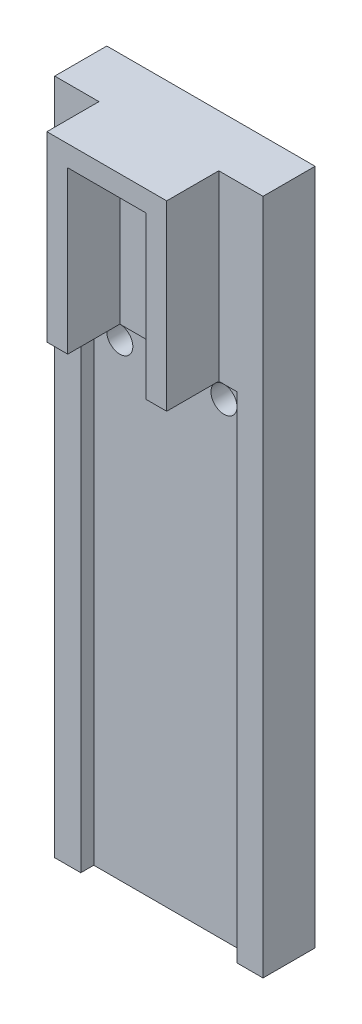
ISO-10303-21;
HEADER;
FILE_DESCRIPTION(('STEP AP214'),'2;1');
FILE_NAME('part.step','',(''),(''),'','','');
FILE_SCHEMA(('AUTOMOTIVE_DESIGN { 1 0 10303 214 1 1 1 1 }'));
ENDSEC;
DATA;
#1=APPLICATION_CONTEXT('core data for automotive mechanical design processes');
#2=APPLICATION_PROTOCOL_DEFINITION('international standard','automotive_design',2000,#1);
#3=PRODUCT_CONTEXT('',#1,'mechanical');
#4=PRODUCT('Part','Part','',(#3));
#5=PRODUCT_RELATED_PRODUCT_CATEGORY('part','',(#4));
#6=PRODUCT_DEFINITION_FORMATION('','',#4);
#7=PRODUCT_DEFINITION_CONTEXT('part definition',#1,'design');
#8=PRODUCT_DEFINITION('design','',#6,#7);
#9=PRODUCT_DEFINITION_SHAPE('','',#8);
#10=(LENGTH_UNIT() NAMED_UNIT(*) SI_UNIT(.MILLI.,.METRE.));
#11=(NAMED_UNIT(*) PLANE_ANGLE_UNIT() SI_UNIT($,.RADIAN.));
#12=(NAMED_UNIT(*) SI_UNIT($,.STERADIAN.) SOLID_ANGLE_UNIT());
#13=UNCERTAINTY_MEASURE_WITH_UNIT(LENGTH_MEASURE(1.E-05),#10,'distance_accuracy_value','');
#14=(GEOMETRIC_REPRESENTATION_CONTEXT(3) GLOBAL_UNCERTAINTY_ASSIGNED_CONTEXT((#13)) GLOBAL_UNIT_ASSIGNED_CONTEXT((#10,
#11,#12)) REPRESENTATION_CONTEXT('',''));
#15=CARTESIAN_POINT('',(0.,0.,0.));
#16=DIRECTION('',(0.,0.,1.));
#17=DIRECTION('',(1.,0.,0.));
#18=AXIS2_PLACEMENT_3D('',#15,#16,#17);
#19=CARTESIAN_POINT('',(0.,0.,6.35));
#20=DIRECTION('',(0.,0.,-1.));
#21=DIRECTION('',(-1.,0.,0.));
#22=AXIS2_PLACEMENT_3D('',#19,#20,#21);
#23=PLANE('',#22);
#24=DIRECTION('',(0.,-1.,0.));
#25=VECTOR('',#24,1.);
#26=CARTESIAN_POINT('',(-7.3025,41.275,6.35));
#27=LINE('',#26,#25);
#28=CARTESIAN_POINT('',(-7.3025,41.275,6.35));
#29=VERTEX_POINT('',#28);
#30=CARTESIAN_POINT('',(-7.3025,19.05,6.35));
#31=VERTEX_POINT('',#30);
#32=EDGE_CURVE('E50',#29,#31,#27,.T.);
#33=ORIENTED_EDGE('',*,*,#32,.F.);
#34=DIRECTION('',(-1.,0.,0.));
#35=VECTOR('',#34,1.);
#36=CARTESIAN_POINT('',(-12.7,41.275,6.35));
#37=LINE('',#36,#35);
#38=CARTESIAN_POINT('',(-12.7,41.275,6.35));
#39=VERTEX_POINT('',#38);
#40=EDGE_CURVE('E257',#29,#39,#37,.T.);
#41=ORIENTED_EDGE('',*,*,#40,.T.);
#42=DIRECTION('',(0.,-1.,0.));
#43=VECTOR('',#42,1.);
#44=CARTESIAN_POINT('',(-12.7,-41.275,6.35));
#45=LINE('',#44,#43);
#46=CARTESIAN_POINT('',(-12.7,-41.275,6.35));
#47=VERTEX_POINT('',#46);
#48=EDGE_CURVE('E260',#39,#47,#45,.T.);
#49=ORIENTED_EDGE('',*,*,#48,.T.);
#50=DIRECTION('',(1.,0.,0.));
#51=VECTOR('',#50,1.);
#52=CARTESIAN_POINT('',(-12.7,-41.275,6.35));
#53=LINE('',#52,#51);
#54=CARTESIAN_POINT('',(-9.525,-41.275,6.35));
#55=VERTEX_POINT('',#54);
#56=EDGE_CURVE('E263',#47,#55,#53,.T.);
#57=ORIENTED_EDGE('',*,*,#56,.T.);
#58=DIRECTION('',(0.,-1.,0.));
#59=VECTOR('',#58,1.);
#60=CARTESIAN_POINT('',(-9.525,-41.275,6.35));
#61=LINE('',#60,#59);
#62=CARTESIAN_POINT('',(-9.525,19.05,6.35));
#63=VERTEX_POINT('',#62);
#64=EDGE_CURVE('E214',#63,#55,#61,.T.);
#65=ORIENTED_EDGE('',*,*,#64,.F.);
#66=DIRECTION('',(-1.,0.,0.));
#67=VECTOR('',#66,1.);
#68=CARTESIAN_POINT('',(-9.525,19.05,6.35));
#69=LINE('',#68,#67);
#70=EDGE_CURVE('E233',#31,#63,#69,.T.);
#71=ORIENTED_EDGE('',*,*,#70,.F.);
#72=EDGE_LOOP('',(#33,#41,#49,#57,#65,#71));
#73=FACE_BOUND('',#72,.T.);
#74=ADVANCED_FACE('F33',(#73),#23,.F.);
#75=DIRECTION('',(0.,1.,0.));
#76=VECTOR('',#75,1.);
#77=CARTESIAN_POINT('',(7.3025,41.275,6.35));
#78=LINE('',#77,#76);
#79=CARTESIAN_POINT('',(7.30249999999999,19.05,6.35));
#80=VERTEX_POINT('',#79);
#81=CARTESIAN_POINT('',(7.3025,41.275,6.35));
#82=VERTEX_POINT('',#81);
#83=EDGE_CURVE('E182',#80,#82,#78,.T.);
#84=ORIENTED_EDGE('',*,*,#83,.F.);
#85=CARTESIAN_POINT('',(9.525,19.05,6.35));
#86=VERTEX_POINT('',#85);
#87=EDGE_CURVE('E219',#86,#80,#69,.T.);
#88=ORIENTED_EDGE('',*,*,#87,.F.);
#89=DIRECTION('',(0.,1.,0.));
#90=VECTOR('',#89,1.);
#91=CARTESIAN_POINT('',(9.52500000000001,-41.275,6.35));
#92=LINE('',#91,#90);
#93=CARTESIAN_POINT('',(9.52500000000001,-41.275,6.35));
#94=VERTEX_POINT('',#93);
#95=EDGE_CURVE('E230',#94,#86,#92,.T.);
#96=ORIENTED_EDGE('',*,*,#95,.F.);
#97=CARTESIAN_POINT('',(12.7,-41.275,6.35));
#98=VERTEX_POINT('',#97);
#99=EDGE_CURVE('E262',#94,#98,#53,.T.);
#100=ORIENTED_EDGE('',*,*,#99,.T.);
#101=DIRECTION('',(0.,1.,0.));
#102=VECTOR('',#101,1.);
#103=CARTESIAN_POINT('',(12.7,-41.275,6.35));
#104=LINE('',#103,#102);
#105=CARTESIAN_POINT('',(12.7,41.275,6.35));
#106=VERTEX_POINT('',#105);
#107=EDGE_CURVE('E255',#98,#106,#104,.T.);
#108=ORIENTED_EDGE('',*,*,#107,.T.);
#109=EDGE_CURVE('E58',#106,#82,#37,.T.);
#110=ORIENTED_EDGE('',*,*,#109,.T.);
#111=EDGE_LOOP('',(#84,#88,#96,#100,#108,#110));
#112=FACE_BOUND('',#111,.T.);
#113=ADVANCED_FACE('F369',(#112),#23,.F.);
#114=DIRECTION('',(0.,-1.,0.));
#115=VECTOR('',#114,1.);
#116=CARTESIAN_POINT('',(4.7625,38.735,6.35));
#117=LINE('',#116,#115);
#118=CARTESIAN_POINT('',(4.7625,32.385,6.35));
#119=VERTEX_POINT('',#118);
#120=CARTESIAN_POINT('',(4.7625,19.05,6.35));
#121=VERTEX_POINT('',#120);
#122=EDGE_CURVE('E11',#119,#121,#117,.T.);
#123=ORIENTED_EDGE('',*,*,#122,.F.);
#124=DIRECTION('',(-1.,0.,0.));
#125=VECTOR('',#124,1.);
#126=CARTESIAN_POINT('',(0.,32.385,6.35));
#127=LINE('',#126,#125);
#128=CARTESIAN_POINT('',(-4.7625,32.385,6.35));
#129=VERTEX_POINT('',#128);
#130=EDGE_CURVE('E206',#119,#129,#127,.T.);
#131=ORIENTED_EDGE('',*,*,#130,.T.);
#132=DIRECTION('',(0.,1.,0.));
#133=VECTOR('',#132,1.);
#134=CARTESIAN_POINT('',(-4.7625,38.735,6.35));
#135=LINE('',#134,#133);
#136=CARTESIAN_POINT('',(-4.7625,19.05,6.35));
#137=VERTEX_POINT('',#136);
#138=EDGE_CURVE('E334',#137,#129,#135,.T.);
#139=ORIENTED_EDGE('',*,*,#138,.F.);
#140=EDGE_CURVE('E235',#121,#137,#69,.T.);
#141=ORIENTED_EDGE('',*,*,#140,.F.);
#142=EDGE_LOOP('',(#123,#131,#139,#141));
#143=FACE_BOUND('',#142,.T.);
#144=ADVANCED_FACE('F326',(#143),#23,.F.);
#145=CARTESIAN_POINT('',(12.7,-41.275,6.35));
#146=DIRECTION('',(-1.,0.,0.));
#147=DIRECTION('',(0.,0.,1.));
#148=AXIS2_PLACEMENT_3D('',#145,#146,#147);
#149=PLANE('',#148);
#150=DIRECTION('',(0.,1.,0.));
#151=VECTOR('',#150,1.);
#152=CARTESIAN_POINT('',(12.7,-41.275,0.));
#153=LINE('',#152,#151);
#154=CARTESIAN_POINT('',(12.7,-41.275,0.));
#155=VERTEX_POINT('',#154);
#156=CARTESIAN_POINT('',(12.7,41.275,0.));
#157=VERTEX_POINT('',#156);
#158=EDGE_CURVE('E252',#155,#157,#153,.T.);
#159=ORIENTED_EDGE('',*,*,#158,.T.);
#160=DIRECTION('',(0.,0.,-1.));
#161=VECTOR('',#160,1.);
#162=CARTESIAN_POINT('',(12.7,41.275,6.35));
#163=LINE('',#162,#161);
#164=EDGE_CURVE('E42',#106,#157,#163,.T.);
#165=ORIENTED_EDGE('',*,*,#164,.F.);
#166=ORIENTED_EDGE('',*,*,#107,.F.);
#167=DIRECTION('',(0.,0.,-1.));
#168=VECTOR('',#167,1.);
#169=CARTESIAN_POINT('',(12.7,-41.275,6.35));
#170=LINE('',#169,#168);
#171=EDGE_CURVE('E266',#98,#155,#170,.T.);
#172=ORIENTED_EDGE('',*,*,#171,.T.);
#173=EDGE_LOOP('',(#159,#165,#166,#172));
#174=FACE_BOUND('',#173,.T.);
#175=ADVANCED_FACE('F35',(#174),#149,.F.);
#176=CARTESIAN_POINT('',(-12.7,41.275,6.35));
#177=DIRECTION('',(0.,-1.,0.));
#178=DIRECTION('',(0.,0.,-1.));
#179=AXIS2_PLACEMENT_3D('',#176,#177,#178);
#180=PLANE('',#179);
#181=DIRECTION('',(-1.,0.,0.));
#182=VECTOR('',#181,1.);
#183=CARTESIAN_POINT('',(-12.7,41.275,0.));
#184=LINE('',#183,#182);
#185=CARTESIAN_POINT('',(-12.7,41.275,0.));
#186=VERTEX_POINT('',#185);
#187=EDGE_CURVE('E269',#157,#186,#184,.T.);
#188=ORIENTED_EDGE('',*,*,#187,.T.);
#189=DIRECTION('',(0.,0.,-1.));
#190=VECTOR('',#189,1.);
#191=CARTESIAN_POINT('',(-12.7,41.275,6.35));
#192=LINE('',#191,#190);
#193=EDGE_CURVE('E279',#39,#186,#192,.T.);
#194=ORIENTED_EDGE('',*,*,#193,.F.);
#195=ORIENTED_EDGE('',*,*,#40,.F.);
#196=DIRECTION('',(0.,0.,-1.));
#197=VECTOR('',#196,1.);
#198=CARTESIAN_POINT('',(-7.3025,41.275,12.7));
#199=LINE('',#198,#197);
#200=CARTESIAN_POINT('',(-7.3025,41.275,12.7));
#201=VERTEX_POINT('',#200);
#202=EDGE_CURVE('E304',#201,#29,#199,.T.);
#203=ORIENTED_EDGE('',*,*,#202,.F.);
#204=DIRECTION('',(-1.,0.,0.));
#205=VECTOR('',#204,1.);
#206=CARTESIAN_POINT('',(-7.3025,41.275,12.7));
#207=LINE('',#206,#205);
#208=CARTESIAN_POINT('',(7.3025,41.275,12.7));
#209=VERTEX_POINT('',#208);
#210=EDGE_CURVE('E178',#209,#201,#207,.T.);
#211=ORIENTED_EDGE('',*,*,#210,.F.);
#212=DIRECTION('',(0.,0.,-1.));
#213=VECTOR('',#212,1.);
#214=CARTESIAN_POINT('',(7.3025,41.275,12.7));
#215=LINE('',#214,#213);
#216=EDGE_CURVE('E305',#209,#82,#215,.T.);
#217=ORIENTED_EDGE('',*,*,#216,.T.);
#218=ORIENTED_EDGE('',*,*,#109,.F.);
#219=ORIENTED_EDGE('',*,*,#164,.T.);
#220=EDGE_LOOP('',(#188,#194,#195,#203,#211,#217,#218,#219));
#221=FACE_BOUND('',#220,.T.);
#222=ADVANCED_FACE('F284',(#221),#180,.F.);
#223=CARTESIAN_POINT('',(-12.7,-41.275,6.35));
#224=DIRECTION('',(1.,0.,0.));
#225=DIRECTION('',(0.,0.,-1.));
#226=AXIS2_PLACEMENT_3D('',#223,#224,#225);
#227=PLANE('',#226);
#228=DIRECTION('',(0.,-1.,0.));
#229=VECTOR('',#228,1.);
#230=CARTESIAN_POINT('',(-12.7,-41.275,0.));
#231=LINE('',#230,#229);
#232=CARTESIAN_POINT('',(-12.7,-41.275,0.));
#233=VERTEX_POINT('',#232);
#234=EDGE_CURVE('E271',#186,#233,#231,.T.);
#235=ORIENTED_EDGE('',*,*,#234,.T.);
#236=DIRECTION('',(0.,0.,-1.));
#237=VECTOR('',#236,1.);
#238=CARTESIAN_POINT('',(-12.7,-41.275,6.35));
#239=LINE('',#238,#237);
#240=EDGE_CURVE('E276',#47,#233,#239,.T.);
#241=ORIENTED_EDGE('',*,*,#240,.F.);
#242=ORIENTED_EDGE('',*,*,#48,.F.);
#243=ORIENTED_EDGE('',*,*,#193,.T.);
#244=EDGE_LOOP('',(#235,#241,#242,#243));
#245=FACE_BOUND('',#244,.T.);
#246=ADVANCED_FACE('F297',(#245),#227,.F.);
#247=CARTESIAN_POINT('',(-12.7,-41.275,6.35));
#248=DIRECTION('',(0.,1.,0.));
#249=DIRECTION('',(0.,0.,1.));
#250=AXIS2_PLACEMENT_3D('',#247,#248,#249);
#251=PLANE('',#250);
#252=DIRECTION('',(1.,0.,0.));
#253=VECTOR('',#252,1.);
#254=CARTESIAN_POINT('',(-9.525,-41.275,4.7625));
#255=LINE('',#254,#253);
#256=CARTESIAN_POINT('',(-9.525,-41.275,4.7625));
#257=VERTEX_POINT('',#256);
#258=CARTESIAN_POINT('',(9.52500000000001,-41.275,4.7625));
#259=VERTEX_POINT('',#258);
#260=EDGE_CURVE('E218',#257,#259,#255,.T.);
#261=ORIENTED_EDGE('',*,*,#260,.F.);
#262=DIRECTION('',(0.,0.,1.));
#263=VECTOR('',#262,1.);
#264=CARTESIAN_POINT('',(-9.525,-41.275,4.7625));
#265=LINE('',#264,#263);
#266=EDGE_CURVE('E228',#257,#55,#265,.T.);
#267=ORIENTED_EDGE('',*,*,#266,.T.);
#268=ORIENTED_EDGE('',*,*,#56,.F.);
#269=ORIENTED_EDGE('',*,*,#240,.T.);
#270=DIRECTION('',(1.,0.,0.));
#271=VECTOR('',#270,1.);
#272=CARTESIAN_POINT('',(-12.7,-41.275,0.));
#273=LINE('',#272,#271);
#274=EDGE_CURVE('E258',#233,#155,#273,.T.);
#275=ORIENTED_EDGE('',*,*,#274,.T.);
#276=ORIENTED_EDGE('',*,*,#171,.F.);
#277=ORIENTED_EDGE('',*,*,#99,.F.);
#278=DIRECTION('',(0.,0.,1.));
#279=VECTOR('',#278,1.);
#280=CARTESIAN_POINT('',(9.52500000000001,-41.275,4.7625));
#281=LINE('',#280,#279);
#282=EDGE_CURVE('E241',#259,#94,#281,.T.);
#283=ORIENTED_EDGE('',*,*,#282,.F.);
#284=EDGE_LOOP('',(#261,#267,#268,#269,#275,#276,#277,#283));
#285=FACE_BOUND('',#284,.T.);
#286=ADVANCED_FACE('F302',(#285),#251,.F.);
#287=CARTESIAN_POINT('',(0.,0.,0.));
#288=DIRECTION('',(0.,0.,-1.));
#289=DIRECTION('',(-1.,0.,0.));
#290=AXIS2_PLACEMENT_3D('',#287,#288,#289);
#291=PLANE('',#290);
#292=DIRECTION('',(0.,1.,0.));
#293=VECTOR('',#292,1.);
#294=CARTESIAN_POINT('',(4.7625,38.735,0.));
#295=LINE('',#294,#293);
#296=CARTESIAN_POINT('',(4.7625,32.385,0.));
#297=VERTEX_POINT('',#296);
#298=CARTESIAN_POINT('',(4.7625,38.735,0.));
#299=VERTEX_POINT('',#298);
#300=EDGE_CURVE('E185',#297,#299,#295,.T.);
#301=ORIENTED_EDGE('',*,*,#300,.T.);
#302=DIRECTION('',(-1.,0.,0.));
#303=VECTOR('',#302,1.);
#304=CARTESIAN_POINT('',(4.7625,38.735,0.));
#305=LINE('',#304,#303);
#306=CARTESIAN_POINT('',(-4.7625,38.735,0.));
#307=VERTEX_POINT('',#306);
#308=EDGE_CURVE('E188',#299,#307,#305,.T.);
#309=ORIENTED_EDGE('',*,*,#308,.T.);
#310=DIRECTION('',(0.,-1.,0.));
#311=VECTOR('',#310,1.);
#312=CARTESIAN_POINT('',(-4.7625,38.735,0.));
#313=LINE('',#312,#311);
#314=CARTESIAN_POINT('',(-4.7625,32.385,0.));
#315=VERTEX_POINT('',#314);
#316=EDGE_CURVE('E196',#307,#315,#313,.T.);
#317=ORIENTED_EDGE('',*,*,#316,.T.);
#318=DIRECTION('',(1.,0.,0.));
#319=VECTOR('',#318,1.);
#320=CARTESIAN_POINT('',(4.7625,32.385,0.));
#321=LINE('',#320,#319);
#322=EDGE_CURVE('E199',#315,#297,#321,.T.);
#323=ORIENTED_EDGE('',*,*,#322,.T.);
#324=EDGE_LOOP('',(#301,#309,#317,#323));
#325=FACE_BOUND('',#324,.T.);
#326=CARTESIAN_POINT('',(-6.35,15.875,0.));
#327=DIRECTION('',(0.,0.,1.));
#328=DIRECTION('',(1.,0.,0.));
#329=AXIS2_PLACEMENT_3D('',#326,#327,#328);
#330=CIRCLE('',#329,1.5875);
#331=CARTESIAN_POINT('',(-4.7625,15.875,0.));
#332=VERTEX_POINT('',#331);
#333=EDGE_CURVE('E249',#332,#332,#330,.T.);
#334=ORIENTED_EDGE('',*,*,#333,.T.);
#335=EDGE_LOOP('',(#334));
#336=FACE_BOUND('',#335,.T.);
#337=CARTESIAN_POINT('',(6.35000000000001,15.875,0.));
#338=DIRECTION('',(0.,0.,1.));
#339=DIRECTION('',(-1.,0.,0.));
#340=AXIS2_PLACEMENT_3D('',#337,#338,#339);
#341=CIRCLE('',#340,1.5875);
#342=CARTESIAN_POINT('',(4.76250000000001,15.875,0.));
#343=VERTEX_POINT('',#342);
#344=EDGE_CURVE('E248',#343,#343,#341,.T.);
#345=ORIENTED_EDGE('',*,*,#344,.T.);
#346=EDGE_LOOP('',(#345));
#347=FACE_BOUND('',#346,.T.);
#348=ORIENTED_EDGE('',*,*,#158,.F.);
#349=ORIENTED_EDGE('',*,*,#274,.F.);
#350=ORIENTED_EDGE('',*,*,#234,.F.);
#351=ORIENTED_EDGE('',*,*,#187,.F.);
#352=EDGE_LOOP('',(#348,#349,#350,#351));
#353=FACE_BOUND('',#352,.T.);
#354=ADVANCED_FACE('F293',(#325,#336,#347,#353),#291,.T.);
#355=CARTESIAN_POINT('',(6.35000000000001,15.875,0.));
#356=DIRECTION('',(0.,0.,1.));
#357=DIRECTION('',(1.,0.,0.));
#358=AXIS2_PLACEMENT_3D('',#355,#356,#357);
#359=CYLINDRICAL_SURFACE('',#358,1.5875);
#360=CARTESIAN_POINT('',(6.35000000000001,15.875,4.7625));
#361=DIRECTION('',(0.,0.,-1.));
#362=DIRECTION('',(-1.,0.,0.));
#363=AXIS2_PLACEMENT_3D('',#360,#361,#362);
#364=CIRCLE('',#363,1.5875);
#365=CARTESIAN_POINT('',(4.76250000000001,15.875,4.7625));
#366=VERTEX_POINT('',#365);
#367=EDGE_CURVE('E245',#366,#366,#364,.F.);
#368=ORIENTED_EDGE('',*,*,#367,.T.);
#369=EDGE_LOOP('',(#368));
#370=FACE_BOUND('',#369,.T.);
#371=ORIENTED_EDGE('',*,*,#344,.F.);
#372=EDGE_LOOP('',(#371));
#373=FACE_BOUND('',#372,.T.);
#374=ADVANCED_FACE('F351',(#370,#373),#359,.F.);
#375=CARTESIAN_POINT('',(-6.35,15.875,0.));
#376=DIRECTION('',(0.,0.,1.));
#377=DIRECTION('',(1.,0.,0.));
#378=AXIS2_PLACEMENT_3D('',#375,#376,#377);
#379=CYLINDRICAL_SURFACE('',#378,1.5875);
#380=CARTESIAN_POINT('',(-6.35,15.875,4.7625));
#381=DIRECTION('',(0.,0.,-1.));
#382=DIRECTION('',(-1.,0.,0.));
#383=AXIS2_PLACEMENT_3D('',#380,#381,#382);
#384=CIRCLE('',#383,1.5875);
#385=CARTESIAN_POINT('',(-7.9375,15.875,4.7625));
#386=VERTEX_POINT('',#385);
#387=EDGE_CURVE('E37',#386,#386,#384,.F.);
#388=ORIENTED_EDGE('',*,*,#387,.T.);
#389=EDGE_LOOP('',(#388));
#390=FACE_BOUND('',#389,.T.);
#391=ORIENTED_EDGE('',*,*,#333,.F.);
#392=EDGE_LOOP('',(#391));
#393=FACE_BOUND('',#392,.T.);
#394=ADVANCED_FACE('F358',(#390,#393),#379,.F.);
#395=CARTESIAN_POINT('',(0.,0.,4.7625));
#396=DIRECTION('',(0.,0.,-1.));
#397=DIRECTION('',(-1.,0.,0.));
#398=AXIS2_PLACEMENT_3D('',#395,#396,#397);
#399=PLANE('',#398);
#400=ORIENTED_EDGE('',*,*,#387,.F.);
#401=EDGE_LOOP('',(#400));
#402=FACE_BOUND('',#401,.T.);
#403=DIRECTION('',(0.,-1.,0.));
#404=VECTOR('',#403,1.);
#405=CARTESIAN_POINT('',(-9.525,-41.275,4.7625));
#406=LINE('',#405,#404);
#407=CARTESIAN_POINT('',(-9.525,19.05,4.7625));
#408=VERTEX_POINT('',#407);
#409=EDGE_CURVE('E215',#408,#257,#406,.T.);
#410=ORIENTED_EDGE('',*,*,#409,.T.);
#411=ORIENTED_EDGE('',*,*,#260,.T.);
#412=DIRECTION('',(0.,1.,0.));
#413=VECTOR('',#412,1.);
#414=CARTESIAN_POINT('',(9.52500000000001,-41.275,4.7625));
#415=LINE('',#414,#413);
#416=CARTESIAN_POINT('',(9.525,19.05,4.7625));
#417=VERTEX_POINT('',#416);
#418=EDGE_CURVE('E222',#259,#417,#415,.T.);
#419=ORIENTED_EDGE('',*,*,#418,.T.);
#420=DIRECTION('',(-1.,0.,0.));
#421=VECTOR('',#420,1.);
#422=CARTESIAN_POINT('',(-9.525,19.05,4.7625));
#423=LINE('',#422,#421);
#424=EDGE_CURVE('E225',#417,#408,#423,.T.);
#425=ORIENTED_EDGE('',*,*,#424,.T.);
#426=EDGE_LOOP('',(#410,#411,#419,#425));
#427=FACE_BOUND('',#426,.T.);
#428=ORIENTED_EDGE('',*,*,#367,.F.);
#429=EDGE_LOOP('',(#428));
#430=FACE_BOUND('',#429,.T.);
#431=ADVANCED_FACE('F364',(#402,#427,#430),#399,.F.);
#432=CARTESIAN_POINT('',(-9.525,-41.275,4.7625));
#433=DIRECTION('',(-1.,0.,0.));
#434=DIRECTION('',(0.,0.,1.));
#435=AXIS2_PLACEMENT_3D('',#432,#433,#434);
#436=PLANE('',#435);
#437=ORIENTED_EDGE('',*,*,#64,.T.);
#438=ORIENTED_EDGE('',*,*,#266,.F.);
#439=ORIENTED_EDGE('',*,*,#409,.F.);
#440=DIRECTION('',(0.,0.,1.));
#441=VECTOR('',#440,1.);
#442=CARTESIAN_POINT('',(-9.525,19.05,4.7625));
#443=LINE('',#442,#441);
#444=EDGE_CURVE('E236',#408,#63,#443,.T.);
#445=ORIENTED_EDGE('',*,*,#444,.T.);
#446=EDGE_LOOP('',(#437,#438,#439,#445));
#447=FACE_BOUND('',#446,.T.);
#448=ADVANCED_FACE('F431',(#447),#436,.F.);
#449=CARTESIAN_POINT('',(-9.525,19.05,4.7625));
#450=DIRECTION('',(0.,1.,0.));
#451=DIRECTION('',(-1.,0.,0.));
#452=AXIS2_PLACEMENT_3D('',#449,#450,#451);
#453=PLANE('',#452);
#454=ORIENTED_EDGE('',*,*,#87,.T.);
#455=DIRECTION('',(0.,0.,-1.));
#456=VECTOR('',#455,1.);
#457=CARTESIAN_POINT('',(7.3025,19.05,12.7));
#458=LINE('',#457,#456);
#459=CARTESIAN_POINT('',(7.3025,19.05,12.7));
#460=VERTEX_POINT('',#459);
#461=EDGE_CURVE('E307',#460,#80,#458,.T.);
#462=ORIENTED_EDGE('',*,*,#461,.F.);
#463=DIRECTION('',(1.,0.,0.));
#464=VECTOR('',#463,1.);
#465=CARTESIAN_POINT('',(4.7625,19.05,12.7));
#466=LINE('',#465,#464);
#467=CARTESIAN_POINT('',(4.7625,19.05,12.7));
#468=VERTEX_POINT('',#467);
#469=EDGE_CURVE('E318',#468,#460,#466,.T.);
#470=ORIENTED_EDGE('',*,*,#469,.F.);
#471=DIRECTION('',(0.,0.,-1.));
#472=VECTOR('',#471,1.);
#473=CARTESIAN_POINT('',(4.7625,19.05,12.7));
#474=LINE('',#473,#472);
#475=EDGE_CURVE('E190',#468,#121,#474,.T.);
#476=ORIENTED_EDGE('',*,*,#475,.T.);
#477=ORIENTED_EDGE('',*,*,#140,.T.);
#478=DIRECTION('',(0.,0.,-1.));
#479=VECTOR('',#478,1.);
#480=CARTESIAN_POINT('',(-4.7625,19.05,12.7));
#481=LINE('',#480,#479);
#482=CARTESIAN_POINT('',(-4.7625,19.05,12.7));
#483=VERTEX_POINT('',#482);
#484=EDGE_CURVE('E168',#483,#137,#481,.T.);
#485=ORIENTED_EDGE('',*,*,#484,.F.);
#486=DIRECTION('',(1.,0.,0.));
#487=VECTOR('',#486,1.);
#488=CARTESIAN_POINT('',(-7.3025,19.05,12.7));
#489=LINE('',#488,#487);
#490=CARTESIAN_POINT('',(-7.3025,19.05,12.7));
#491=VERTEX_POINT('',#490);
#492=EDGE_CURVE('E160',#491,#483,#489,.T.);
#493=ORIENTED_EDGE('',*,*,#492,.F.);
#494=DIRECTION('',(0.,0.,-1.));
#495=VECTOR('',#494,1.);
#496=CARTESIAN_POINT('',(-7.3025,19.05,12.7));
#497=LINE('',#496,#495);
#498=EDGE_CURVE('E165',#491,#31,#497,.T.);
#499=ORIENTED_EDGE('',*,*,#498,.T.);
#500=ORIENTED_EDGE('',*,*,#70,.T.);
#501=ORIENTED_EDGE('',*,*,#444,.F.);
#502=ORIENTED_EDGE('',*,*,#424,.F.);
#503=DIRECTION('',(0.,0.,1.));
#504=VECTOR('',#503,1.);
#505=CARTESIAN_POINT('',(9.525,19.05,4.7625));
#506=LINE('',#505,#504);
#507=EDGE_CURVE('E239',#417,#86,#506,.T.);
#508=ORIENTED_EDGE('',*,*,#507,.T.);
#509=EDGE_LOOP('',(#454,#462,#470,#476,#477,#485,#493,#499,#500,#501,#502,#508));
#510=FACE_BOUND('',#509,.T.);
#511=ADVANCED_FACE('F163',(#510),#453,.F.);
#512=CARTESIAN_POINT('',(9.52500000000001,-41.275,4.7625));
#513=DIRECTION('',(1.,0.,0.));
#514=DIRECTION('',(0.,1.,0.));
#515=AXIS2_PLACEMENT_3D('',#512,#513,#514);
#516=PLANE('',#515);
#517=ORIENTED_EDGE('',*,*,#95,.T.);
#518=ORIENTED_EDGE('',*,*,#507,.F.);
#519=ORIENTED_EDGE('',*,*,#418,.F.);
#520=ORIENTED_EDGE('',*,*,#282,.T.);
#521=EDGE_LOOP('',(#517,#518,#519,#520));
#522=FACE_BOUND('',#521,.T.);
#523=ADVANCED_FACE('F400',(#522),#516,.F.);
#524=CARTESIAN_POINT('',(4.7625,38.735,0.));
#525=DIRECTION('',(1.,0.,0.));
#526=DIRECTION('',(0.,1.,0.));
#527=AXIS2_PLACEMENT_3D('',#524,#525,#526);
#528=PLANE('',#527);
#529=DIRECTION('',(0.,0.,1.));
#530=VECTOR('',#529,1.);
#531=CARTESIAN_POINT('',(4.7625,38.735,0.));
#532=LINE('',#531,#530);
#533=CARTESIAN_POINT('',(4.7625,38.735,12.7));
#534=VERTEX_POINT('',#533);
#535=EDGE_CURVE('E202',#299,#534,#532,.T.);
#536=ORIENTED_EDGE('',*,*,#535,.F.);
#537=ORIENTED_EDGE('',*,*,#300,.F.);
#538=DIRECTION('',(0.,0.,1.));
#539=VECTOR('',#538,1.);
#540=CARTESIAN_POINT('',(4.7625,32.385,0.));
#541=LINE('',#540,#539);
#542=EDGE_CURVE('E203',#297,#119,#541,.T.);
#543=ORIENTED_EDGE('',*,*,#542,.T.);
#544=ORIENTED_EDGE('',*,*,#122,.T.);
#545=ORIENTED_EDGE('',*,*,#475,.F.);
#546=DIRECTION('',(0.,-1.,0.));
#547=VECTOR('',#546,1.);
#548=CARTESIAN_POINT('',(4.7625,38.735,12.7));
#549=LINE('',#548,#547);
#550=EDGE_CURVE('E322',#534,#468,#549,.T.);
#551=ORIENTED_EDGE('',*,*,#550,.F.);
#552=EDGE_LOOP('',(#536,#537,#543,#544,#545,#551));
#553=FACE_BOUND('',#552,.T.);
#554=ADVANCED_FACE('F321',(#553),#528,.F.);
#555=CARTESIAN_POINT('',(4.7625,32.385,0.));
#556=DIRECTION('',(0.,-1.,0.));
#557=DIRECTION('',(1.,0.,0.));
#558=AXIS2_PLACEMENT_3D('',#555,#556,#557);
#559=PLANE('',#558);
#560=ORIENTED_EDGE('',*,*,#542,.F.);
#561=ORIENTED_EDGE('',*,*,#322,.F.);
#562=DIRECTION('',(0.,0.,1.));
#563=VECTOR('',#562,1.);
#564=CARTESIAN_POINT('',(-4.7625,32.385,0.));
#565=LINE('',#564,#563);
#566=EDGE_CURVE('E207',#315,#129,#565,.T.);
#567=ORIENTED_EDGE('',*,*,#566,.T.);
#568=ORIENTED_EDGE('',*,*,#130,.F.);
#569=EDGE_LOOP('',(#560,#561,#567,#568));
#570=FACE_BOUND('',#569,.T.);
#571=ADVANCED_FACE('F329',(#570),#559,.F.);
#572=CARTESIAN_POINT('',(-4.7625,38.735,0.));
#573=DIRECTION('',(-1.,0.,0.));
#574=DIRECTION('',(0.,-1.,0.));
#575=AXIS2_PLACEMENT_3D('',#572,#573,#574);
#576=PLANE('',#575);
#577=ORIENTED_EDGE('',*,*,#566,.F.);
#578=ORIENTED_EDGE('',*,*,#316,.F.);
#579=DIRECTION('',(0.,0.,1.));
#580=VECTOR('',#579,1.);
#581=CARTESIAN_POINT('',(-4.7625,38.735,0.));
#582=LINE('',#581,#580);
#583=CARTESIAN_POINT('',(-4.7625,38.735,12.7));
#584=VERTEX_POINT('',#583);
#585=EDGE_CURVE('E209',#307,#584,#582,.T.);
#586=ORIENTED_EDGE('',*,*,#585,.T.);
#587=DIRECTION('',(0.,1.,0.));
#588=VECTOR('',#587,1.);
#589=CARTESIAN_POINT('',(-4.7625,38.735,12.7));
#590=LINE('',#589,#588);
#591=EDGE_CURVE('E172',#483,#584,#590,.T.);
#592=ORIENTED_EDGE('',*,*,#591,.F.);
#593=ORIENTED_EDGE('',*,*,#484,.T.);
#594=ORIENTED_EDGE('',*,*,#138,.T.);
#595=EDGE_LOOP('',(#577,#578,#586,#592,#593,#594));
#596=FACE_BOUND('',#595,.T.);
#597=ADVANCED_FACE('F332',(#596),#576,.F.);
#598=CARTESIAN_POINT('',(4.7625,38.735,0.));
#599=DIRECTION('',(0.,1.,0.));
#600=DIRECTION('',(0.,0.,1.));
#601=AXIS2_PLACEMENT_3D('',#598,#599,#600);
#602=PLANE('',#601);
#603=ORIENTED_EDGE('',*,*,#585,.F.);
#604=ORIENTED_EDGE('',*,*,#308,.F.);
#605=ORIENTED_EDGE('',*,*,#535,.T.);
#606=DIRECTION('',(1.,0.,0.));
#607=VECTOR('',#606,1.);
#608=CARTESIAN_POINT('',(-4.7625,38.735,12.7));
#609=LINE('',#608,#607);
#610=EDGE_CURVE('E341',#584,#534,#609,.T.);
#611=ORIENTED_EDGE('',*,*,#610,.F.);
#612=EDGE_LOOP('',(#603,#604,#605,#611));
#613=FACE_BOUND('',#612,.T.);
#614=ADVANCED_FACE('F346',(#613),#602,.F.);
#615=CARTESIAN_POINT('',(-7.3025,41.275,12.7));
#616=DIRECTION('',(1.,0.,0.));
#617=DIRECTION('',(0.,1.,0.));
#618=AXIS2_PLACEMENT_3D('',#615,#616,#617);
#619=PLANE('',#618);
#620=ORIENTED_EDGE('',*,*,#32,.T.);
#621=ORIENTED_EDGE('',*,*,#498,.F.);
#622=DIRECTION('',(0.,-1.,0.));
#623=VECTOR('',#622,1.);
#624=CARTESIAN_POINT('',(-7.3025,41.275,12.7));
#625=LINE('',#624,#623);
#626=EDGE_CURVE('E173',#201,#491,#625,.T.);
#627=ORIENTED_EDGE('',*,*,#626,.F.);
#628=ORIENTED_EDGE('',*,*,#202,.T.);
#629=EDGE_LOOP('',(#620,#621,#627,#628));
#630=FACE_BOUND('',#629,.T.);
#631=ADVANCED_FACE('F184',(#630),#619,.F.);
#632=CARTESIAN_POINT('',(7.3025,41.275,12.7));
#633=DIRECTION('',(-1.,0.,0.));
#634=DIRECTION('',(0.,-1.,0.));
#635=AXIS2_PLACEMENT_3D('',#632,#633,#634);
#636=PLANE('',#635);
#637=ORIENTED_EDGE('',*,*,#83,.T.);
#638=ORIENTED_EDGE('',*,*,#216,.F.);
#639=DIRECTION('',(0.,1.,0.));
#640=VECTOR('',#639,1.);
#641=CARTESIAN_POINT('',(7.3025,41.275,12.7));
#642=LINE('',#641,#640);
#643=EDGE_CURVE('E309',#460,#209,#642,.T.);
#644=ORIENTED_EDGE('',*,*,#643,.F.);
#645=ORIENTED_EDGE('',*,*,#461,.T.);
#646=EDGE_LOOP('',(#637,#638,#644,#645));
#647=FACE_BOUND('',#646,.T.);
#648=ADVANCED_FACE('F475',(#647),#636,.F.);
#649=CARTESIAN_POINT('',(0.,0.,12.7));
#650=DIRECTION('',(0.,0.,1.));
#651=DIRECTION('',(1.,0.,0.));
#652=AXIS2_PLACEMENT_3D('',#649,#650,#651);
#653=PLANE('',#652);
#654=ORIENTED_EDGE('',*,*,#626,.T.);
#655=ORIENTED_EDGE('',*,*,#492,.T.);
#656=ORIENTED_EDGE('',*,*,#591,.T.);
#657=ORIENTED_EDGE('',*,*,#610,.T.);
#658=ORIENTED_EDGE('',*,*,#550,.T.);
#659=ORIENTED_EDGE('',*,*,#469,.T.);
#660=ORIENTED_EDGE('',*,*,#643,.T.);
#661=ORIENTED_EDGE('',*,*,#210,.T.);
#662=EDGE_LOOP('',(#654,#655,#656,#657,#658,#659,#660,#661));
#663=FACE_BOUND('',#662,.T.);
#664=ADVANCED_FACE('F176',(#663),#653,.T.);
#665=CLOSED_SHELL('',(#74,#113,#144,#175,#222,#246,#286,#354,#374,#394,#431,#448,#511,#523,#554,
#571,#597,#614,#631,#648,#664));
#666=MANIFOLD_SOLID_BREP('B2',#665);
#667=ADVANCED_BREP_SHAPE_REPRESENTATION('',(#18,#666),#14);
#668=SHAPE_DEFINITION_REPRESENTATION(#9,#667);
ENDSEC;
END-ISO-10303-21;
